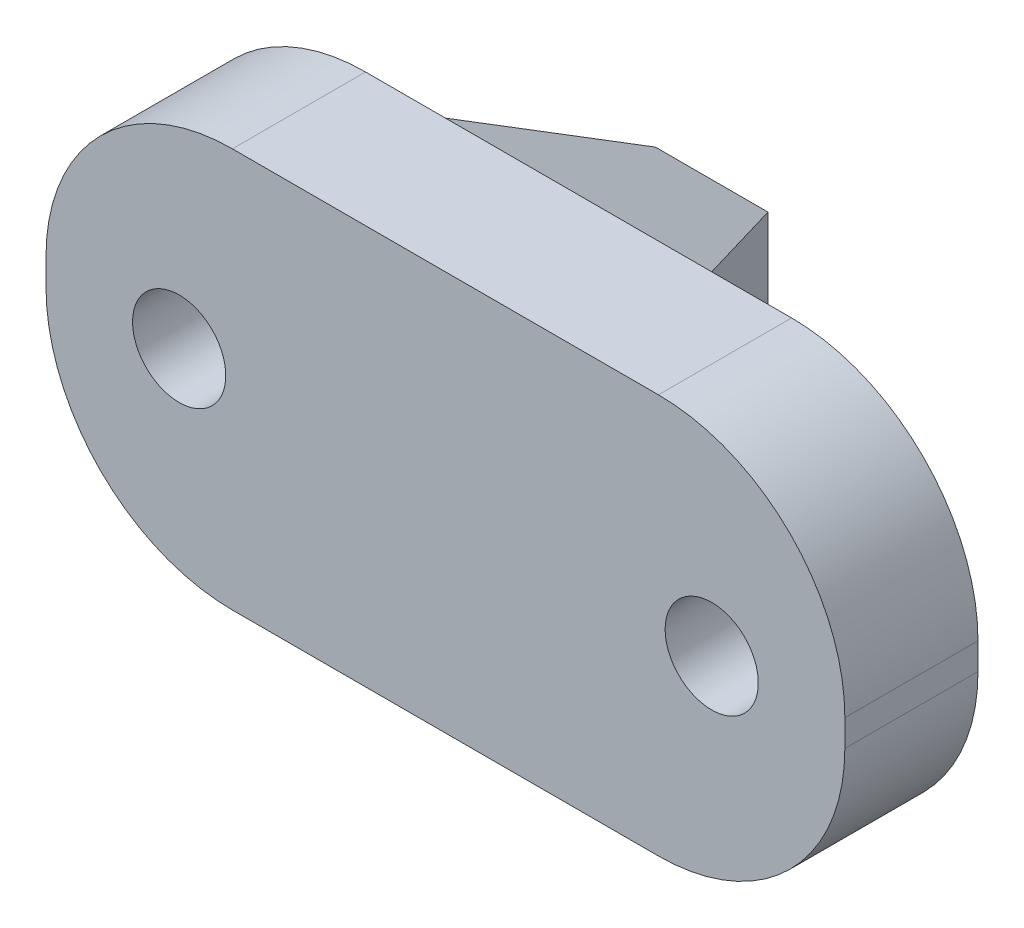
ISO-10303-21;
HEADER;
FILE_DESCRIPTION(('STEP AP214'),'2;1');
FILE_NAME('part.step','',(''),(''),'','','');
FILE_SCHEMA(('AUTOMOTIVE_DESIGN { 1 0 10303 214 1 1 1 1 }'));
ENDSEC;
DATA;
#1=APPLICATION_CONTEXT('core data for automotive mechanical design processes');
#2=APPLICATION_PROTOCOL_DEFINITION('international standard','automotive_design',2000,#1);
#3=PRODUCT_CONTEXT('',#1,'mechanical');
#4=PRODUCT('Part','Part','',(#3));
#5=PRODUCT_RELATED_PRODUCT_CATEGORY('part','',(#4));
#6=PRODUCT_DEFINITION_FORMATION('','',#4);
#7=PRODUCT_DEFINITION_CONTEXT('part definition',#1,'design');
#8=PRODUCT_DEFINITION('design','',#6,#7);
#9=PRODUCT_DEFINITION_SHAPE('','',#8);
#10=(LENGTH_UNIT() NAMED_UNIT(*) SI_UNIT(.MILLI.,.METRE.));
#11=(NAMED_UNIT(*) PLANE_ANGLE_UNIT() SI_UNIT($,.RADIAN.));
#12=(NAMED_UNIT(*) SI_UNIT($,.STERADIAN.) SOLID_ANGLE_UNIT());
#13=UNCERTAINTY_MEASURE_WITH_UNIT(LENGTH_MEASURE(1.E-05),#10,'distance_accuracy_value','');
#14=(GEOMETRIC_REPRESENTATION_CONTEXT(3) GLOBAL_UNCERTAINTY_ASSIGNED_CONTEXT((#13)) GLOBAL_UNIT_ASSIGNED_CONTEXT((#10,
#11,#12)) REPRESENTATION_CONTEXT('',''));
#15=CARTESIAN_POINT('',(0.,0.,0.));
#16=DIRECTION('',(0.,0.,1.));
#17=DIRECTION('',(1.,0.,0.));
#18=AXIS2_PLACEMENT_3D('',#15,#16,#17);
#19=CARTESIAN_POINT('',(-10.,7.5,9.99999999999998));
#20=DIRECTION('',(0.,0.,-1.));
#21=DIRECTION('',(-1.,0.,0.));
#22=AXIS2_PLACEMENT_3D('',#19,#20,#21);
#23=CYLINDRICAL_SURFACE('',#22,1.75);
#24=CARTESIAN_POINT('',(-10.,7.5,0.));
#25=DIRECTION('',(0.,0.,-1.));
#26=DIRECTION('',(-1.,0.,0.));
#27=AXIS2_PLACEMENT_3D('',#24,#25,#26);
#28=CIRCLE('',#27,1.75);
#29=CARTESIAN_POINT('',(-11.75,7.5,0.));
#30=VERTEX_POINT('',#29);
#31=EDGE_CURVE('E202',#30,#30,#28,.T.);
#32=ORIENTED_EDGE('',*,*,#31,.F.);
#33=EDGE_LOOP('',(#32));
#34=FACE_BOUND('',#33,.T.);
#35=CARTESIAN_POINT('',(-10.,7.5,-3.00000000000002));
#36=DIRECTION('',(0.,0.,-1.));
#37=DIRECTION('',(-1.,0.,0.));
#38=AXIS2_PLACEMENT_3D('',#35,#36,#37);
#39=CIRCLE('',#38,1.75);
#40=CARTESIAN_POINT('',(-11.75,7.5,-3.00000000000002));
#41=VERTEX_POINT('',#40);
#42=EDGE_CURVE('E204',#41,#41,#39,.F.);
#43=ORIENTED_EDGE('',*,*,#42,.F.);
#44=EDGE_LOOP('',(#43));
#45=FACE_BOUND('',#44,.T.);
#46=ADVANCED_FACE('F33',(#34,#45),#23,.F.);
#47=CARTESIAN_POINT('',(9.99999999999999,7.5,9.99999999999999));
#48=DIRECTION('',(0.,0.,-1.));
#49=DIRECTION('',(-1.,0.,0.));
#50=AXIS2_PLACEMENT_3D('',#47,#48,#49);
#51=CYLINDRICAL_SURFACE('',#50,1.75);
#52=CARTESIAN_POINT('',(9.99999999999999,7.5,0.));
#53=DIRECTION('',(0.,0.,-1.));
#54=DIRECTION('',(-1.,0.,0.));
#55=AXIS2_PLACEMENT_3D('',#52,#53,#54);
#56=CIRCLE('',#55,1.75);
#57=CARTESIAN_POINT('',(8.24999999999999,7.5,0.));
#58=VERTEX_POINT('',#57);
#59=EDGE_CURVE('E285',#58,#58,#56,.T.);
#60=ORIENTED_EDGE('',*,*,#59,.F.);
#61=EDGE_LOOP('',(#60));
#62=FACE_BOUND('',#61,.T.);
#63=CARTESIAN_POINT('',(10.,7.5,-3.));
#64=DIRECTION('',(0.,0.,-1.));
#65=DIRECTION('',(-1.,0.,0.));
#66=AXIS2_PLACEMENT_3D('',#63,#64,#65);
#67=CIRCLE('',#66,1.75);
#68=CARTESIAN_POINT('',(8.25,7.5,-3.00000000000001));
#69=VERTEX_POINT('',#68);
#70=EDGE_CURVE('E199',#69,#69,#67,.F.);
#71=ORIENTED_EDGE('',*,*,#70,.F.);
#72=EDGE_LOOP('',(#71));
#73=FACE_BOUND('',#72,.T.);
#74=ADVANCED_FACE('F345',(#62,#73),#51,.F.);
#75=CARTESIAN_POINT('',(-15.,15.,-5.));
#76=DIRECTION('',(1.,0.,0.));
#77=DIRECTION('',(0.,0.,-1.));
#78=AXIS2_PLACEMENT_3D('',#75,#76,#77);
#79=PLANE('',#78);
#80=DIRECTION('',(0.,-1.,0.));
#81=VECTOR('',#80,1.);
#82=CARTESIAN_POINT('',(-15.,15.,-5.));
#83=LINE('',#82,#81);
#84=CARTESIAN_POINT('',(-15.,8.,-5.));
#85=VERTEX_POINT('',#84);
#86=CARTESIAN_POINT('',(-15.,7.,-5.));
#87=VERTEX_POINT('',#86);
#88=EDGE_CURVE('E181',#85,#87,#83,.T.);
#89=ORIENTED_EDGE('',*,*,#88,.T.);
#90=DIRECTION('',(0.,0.,1.));
#91=VECTOR('',#90,1.);
#92=CARTESIAN_POINT('',(-15.,7.,-5.));
#93=LINE('',#92,#91);
#94=CARTESIAN_POINT('',(-15.,7.,0.));
#95=VERTEX_POINT('',#94);
#96=EDGE_CURVE('E232',#87,#95,#93,.T.);
#97=ORIENTED_EDGE('',*,*,#96,.T.);
#98=DIRECTION('',(0.,-1.,0.));
#99=VECTOR('',#98,1.);
#100=CARTESIAN_POINT('',(-15.,15.,0.));
#101=LINE('',#100,#99);
#102=CARTESIAN_POINT('',(-15.,8.,0.));
#103=VERTEX_POINT('',#102);
#104=EDGE_CURVE('E195',#103,#95,#101,.T.);
#105=ORIENTED_EDGE('',*,*,#104,.F.);
#106=DIRECTION('',(0.,0.,1.));
#107=VECTOR('',#106,1.);
#108=CARTESIAN_POINT('',(-15.,8.,-5.));
#109=LINE('',#108,#107);
#110=EDGE_CURVE('E230',#103,#85,#109,.F.);
#111=ORIENTED_EDGE('',*,*,#110,.T.);
#112=EDGE_LOOP('',(#89,#97,#105,#111));
#113=FACE_BOUND('',#112,.T.);
#114=ADVANCED_FACE('F300',(#113),#79,.F.);
#115=CARTESIAN_POINT('',(-15.,15.,0.));
#116=DIRECTION('',(0.,0.,-1.));
#117=DIRECTION('',(-1.,0.,0.));
#118=AXIS2_PLACEMENT_3D('',#115,#116,#117);
#119=PLANE('',#118);
#120=ORIENTED_EDGE('',*,*,#31,.T.);
#121=EDGE_LOOP('',(#120));
#122=FACE_BOUND('',#121,.T.);
#123=ORIENTED_EDGE('',*,*,#59,.T.);
#124=EDGE_LOOP('',(#123));
#125=FACE_BOUND('',#124,.T.);
#126=ORIENTED_EDGE('',*,*,#104,.T.);
#127=CARTESIAN_POINT('',(-8.,7.,0.));
#128=DIRECTION('',(0.,0.,-1.));
#129=DIRECTION('',(-1.,0.,0.));
#130=AXIS2_PLACEMENT_3D('',#127,#128,#129);
#131=CIRCLE('',#130,7.);
#132=CARTESIAN_POINT('',(-8.,0.,0.));
#133=VERTEX_POINT('',#132);
#134=EDGE_CURVE('E241',#95,#133,#131,.F.);
#135=ORIENTED_EDGE('',*,*,#134,.T.);
#136=DIRECTION('',(1.,0.,0.));
#137=VECTOR('',#136,1.);
#138=CARTESIAN_POINT('',(-15.,0.,0.));
#139=LINE('',#138,#137);
#140=CARTESIAN_POINT('',(8.,0.,0.));
#141=VERTEX_POINT('',#140);
#142=EDGE_CURVE('E282',#133,#141,#139,.T.);
#143=ORIENTED_EDGE('',*,*,#142,.T.);
#144=CARTESIAN_POINT('',(8.,7.,0.));
#145=DIRECTION('',(0.,0.,-1.));
#146=DIRECTION('',(-1.,0.,0.));
#147=AXIS2_PLACEMENT_3D('',#144,#145,#146);
#148=CIRCLE('',#147,7.);
#149=CARTESIAN_POINT('',(15.,7.,0.));
#150=VERTEX_POINT('',#149);
#151=EDGE_CURVE('E237',#141,#150,#148,.F.);
#152=ORIENTED_EDGE('',*,*,#151,.T.);
#153=DIRECTION('',(0.,-1.,0.));
#154=VECTOR('',#153,1.);
#155=CARTESIAN_POINT('',(15.,15.,0.));
#156=LINE('',#155,#154);
#157=CARTESIAN_POINT('',(15.,8.,0.));
#158=VERTEX_POINT('',#157);
#159=EDGE_CURVE('E192',#158,#150,#156,.T.);
#160=ORIENTED_EDGE('',*,*,#159,.F.);
#161=CARTESIAN_POINT('',(8.,8.,0.));
#162=DIRECTION('',(0.,0.,-1.));
#163=DIRECTION('',(-1.,0.,0.));
#164=AXIS2_PLACEMENT_3D('',#161,#162,#163);
#165=CIRCLE('',#164,7.);
#166=CARTESIAN_POINT('',(8.,15.,0.));
#167=VERTEX_POINT('',#166);
#168=EDGE_CURVE('E235',#158,#167,#165,.F.);
#169=ORIENTED_EDGE('',*,*,#168,.T.);
#170=DIRECTION('',(1.,0.,0.));
#171=VECTOR('',#170,1.);
#172=CARTESIAN_POINT('',(-15.,15.,0.));
#173=LINE('',#172,#171);
#174=CARTESIAN_POINT('',(-8.,15.,0.));
#175=VERTEX_POINT('',#174);
#176=EDGE_CURVE('E274',#175,#167,#173,.T.);
#177=ORIENTED_EDGE('',*,*,#176,.F.);
#178=CARTESIAN_POINT('',(-8.,8.,0.));
#179=DIRECTION('',(0.,0.,-1.));
#180=DIRECTION('',(-1.,0.,0.));
#181=AXIS2_PLACEMENT_3D('',#178,#179,#180);
#182=CIRCLE('',#181,7.);
#183=EDGE_CURVE('E239',#175,#103,#182,.F.);
#184=ORIENTED_EDGE('',*,*,#183,.T.);
#185=EDGE_LOOP('',(#126,#135,#143,#152,#160,#169,#177,#184));
#186=FACE_BOUND('',#185,.T.);
#187=ADVANCED_FACE('F265',(#122,#125,#186),#119,.F.);
#188=CARTESIAN_POINT('',(15.,15.,0.));
#189=DIRECTION('',(-1.,0.,0.));
#190=DIRECTION('',(0.,0.,1.));
#191=AXIS2_PLACEMENT_3D('',#188,#189,#190);
#192=PLANE('',#191);
#193=ORIENTED_EDGE('',*,*,#159,.T.);
#194=DIRECTION('',(0.,0.,-1.));
#195=VECTOR('',#194,1.);
#196=CARTESIAN_POINT('',(15.,7.,0.));
#197=LINE('',#196,#195);
#198=CARTESIAN_POINT('',(15.,7.,-5.));
#199=VERTEX_POINT('',#198);
#200=EDGE_CURVE('E11',#150,#199,#197,.T.);
#201=ORIENTED_EDGE('',*,*,#200,.T.);
#202=DIRECTION('',(0.,-1.,0.));
#203=VECTOR('',#202,1.);
#204=CARTESIAN_POINT('',(15.,15.,-5.));
#205=LINE('',#204,#203);
#206=CARTESIAN_POINT('',(15.,8.,-5.));
#207=VERTEX_POINT('',#206);
#208=EDGE_CURVE('E190',#207,#199,#205,.T.);
#209=ORIENTED_EDGE('',*,*,#208,.F.);
#210=DIRECTION('',(0.,0.,-1.));
#211=VECTOR('',#210,1.);
#212=CARTESIAN_POINT('',(15.,8.,0.));
#213=LINE('',#212,#211);
#214=EDGE_CURVE('E41',#207,#158,#213,.F.);
#215=ORIENTED_EDGE('',*,*,#214,.T.);
#216=EDGE_LOOP('',(#193,#201,#209,#215));
#217=FACE_BOUND('',#216,.T.);
#218=ADVANCED_FACE('F261',(#217),#192,.F.);
#219=CARTESIAN_POINT('',(5.,15.,-5.00000000000001));
#220=DIRECTION('',(-0.866025403784439,0.,0.499999999999999));
#221=DIRECTION('',(0.499999999999999,0.,0.866025403784439));
#222=AXIS2_PLACEMENT_3D('',#219,#220,#221);
#223=PLANE('',#222);
#224=DIRECTION('',(0.,-1.,0.));
#225=VECTOR('',#224,1.);
#226=CARTESIAN_POINT('',(5.,15.,-5.00000000000001));
#227=LINE('',#226,#225);
#228=CARTESIAN_POINT('',(5.,15.,-5.00000000000001));
#229=VERTEX_POINT('',#228);
#230=CARTESIAN_POINT('',(5.00000000000001,10.,-5.));
#231=VERTEX_POINT('',#230);
#232=EDGE_CURVE('E188',#229,#231,#227,.T.);
#233=ORIENTED_EDGE('',*,*,#232,.T.);
#234=DIRECTION('',(-0.499999999999999,0.,-0.866025403784439));
#235=VECTOR('',#234,1.);
#236=CARTESIAN_POINT('',(5.,10.,-5.00000000000001));
#237=LINE('',#236,#235);
#238=CARTESIAN_POINT('',(3.26794919243113,10.,-8.));
#239=VERTEX_POINT('',#238);
#240=EDGE_CURVE('E153',#231,#239,#237,.T.);
#241=ORIENTED_EDGE('',*,*,#240,.T.);
#242=DIRECTION('',(0.,-1.,0.));
#243=VECTOR('',#242,1.);
#244=CARTESIAN_POINT('',(3.26794919243113,15.,-8.));
#245=LINE('',#244,#243);
#246=CARTESIAN_POINT('',(3.26794919243113,5.,-8.));
#247=VERTEX_POINT('',#246);
#248=EDGE_CURVE('E328',#239,#247,#245,.T.);
#249=ORIENTED_EDGE('',*,*,#248,.T.);
#250=DIRECTION('',(0.499999999999999,0.,0.866025403784439));
#251=VECTOR('',#250,1.);
#252=CARTESIAN_POINT('',(5.,5.,-5.00000000000001));
#253=LINE('',#252,#251);
#254=CARTESIAN_POINT('',(5.,5.,-5.00000000000001));
#255=VERTEX_POINT('',#254);
#256=EDGE_CURVE('E169',#247,#255,#253,.T.);
#257=ORIENTED_EDGE('',*,*,#256,.T.);
#258=CARTESIAN_POINT('',(5.,0.,-5.00000000000001));
#259=VERTEX_POINT('',#258);
#260=EDGE_CURVE('E187',#255,#259,#227,.T.);
#261=ORIENTED_EDGE('',*,*,#260,.T.);
#262=DIRECTION('',(0.472455591261534,-0.327326835353986,0.818317088384973));
#263=VECTOR('',#262,1.);
#264=CARTESIAN_POINT('',(2.11324865405188,2.00000000000001,-10.));
#265=LINE('',#264,#263);
#266=CARTESIAN_POINT('',(2.11324865405188,2.00000000000001,-10.));
#267=VERTEX_POINT('',#266);
#268=EDGE_CURVE('E227',#259,#267,#265,.F.);
#269=ORIENTED_EDGE('',*,*,#268,.T.);
#270=DIRECTION('',(0.,-1.,0.));
#271=VECTOR('',#270,1.);
#272=CARTESIAN_POINT('',(2.11324865405188,15.,-10.));
#273=LINE('',#272,#271);
#274=CARTESIAN_POINT('',(2.11324865405188,13.,-10.));
#275=VERTEX_POINT('',#274);
#276=EDGE_CURVE('E179',#275,#267,#273,.T.);
#277=ORIENTED_EDGE('',*,*,#276,.F.);
#278=DIRECTION('',(0.472455591261533,0.327326835353987,0.818317088384973));
#279=VECTOR('',#278,1.);
#280=CARTESIAN_POINT('',(3.8839285714286,14.2267630323353,-6.93309241916167));
#281=LINE('',#280,#279);
#282=EDGE_CURVE('E215',#275,#229,#281,.T.);
#283=ORIENTED_EDGE('',*,*,#282,.T.);
#284=EDGE_LOOP('',(#233,#241,#249,#257,#261,#269,#277,#283));
#285=FACE_BOUND('',#284,.T.);
#286=ADVANCED_FACE('F384',(#285),#223,.F.);
#287=CARTESIAN_POINT('',(2.11324865405188,15.,-10.));
#288=DIRECTION('',(0.,0.,1.));
#289=DIRECTION('',(1.,0.,0.));
#290=AXIS2_PLACEMENT_3D('',#287,#288,#289);
#291=PLANE('',#290);
#292=ORIENTED_EDGE('',*,*,#276,.T.);
#293=DIRECTION('',(-1.,0.,0.));
#294=VECTOR('',#293,1.);
#295=CARTESIAN_POINT('',(2.11324865405188,2.00000000000001,-10.));
#296=LINE('',#295,#294);
#297=CARTESIAN_POINT('',(-2.11324865405188,2.00000000000001,-10.));
#298=VERTEX_POINT('',#297);
#299=EDGE_CURVE('E218',#267,#298,#296,.T.);
#300=ORIENTED_EDGE('',*,*,#299,.T.);
#301=DIRECTION('',(0.,-1.,0.));
#302=VECTOR('',#301,1.);
#303=CARTESIAN_POINT('',(-2.11324865405188,15.,-10.));
#304=LINE('',#303,#302);
#305=CARTESIAN_POINT('',(-2.11324865405188,13.,-10.));
#306=VERTEX_POINT('',#305);
#307=EDGE_CURVE('E175',#306,#298,#304,.T.);
#308=ORIENTED_EDGE('',*,*,#307,.F.);
#309=DIRECTION('',(1.,0.,0.));
#310=VECTOR('',#309,1.);
#311=CARTESIAN_POINT('',(2.11324865405188,13.,-10.));
#312=LINE('',#311,#310);
#313=EDGE_CURVE('E213',#306,#275,#312,.T.);
#314=ORIENTED_EDGE('',*,*,#313,.T.);
#315=EDGE_LOOP('',(#292,#300,#308,#314));
#316=FACE_BOUND('',#315,.T.);
#317=ADVANCED_FACE('F313',(#316),#291,.F.);
#318=CARTESIAN_POINT('',(-2.11324865405188,15.,-10.));
#319=DIRECTION('',(0.866025403784439,0.,0.499999999999999));
#320=DIRECTION('',(0.499999999999999,0.,-0.866025403784439));
#321=AXIS2_PLACEMENT_3D('',#318,#319,#320);
#322=PLANE('',#321);
#323=DIRECTION('',(0.,1.,0.));
#324=VECTOR('',#323,1.);
#325=CARTESIAN_POINT('',(-3.26794919243113,15.,-8.));
#326=LINE('',#325,#324);
#327=CARTESIAN_POINT('',(-3.26794919243113,5.,-8.));
#328=VERTEX_POINT('',#327);
#329=CARTESIAN_POINT('',(-3.26794919243113,10.,-8.));
#330=VERTEX_POINT('',#329);
#331=EDGE_CURVE('E168',#328,#330,#326,.T.);
#332=ORIENTED_EDGE('',*,*,#331,.T.);
#333=DIRECTION('',(-0.499999999999999,0.,0.866025403784439));
#334=VECTOR('',#333,1.);
#335=CARTESIAN_POINT('',(-2.11324865405188,10.,-10.));
#336=LINE('',#335,#334);
#337=CARTESIAN_POINT('',(-5.,10.,-5.));
#338=VERTEX_POINT('',#337);
#339=EDGE_CURVE('E150',#330,#338,#336,.T.);
#340=ORIENTED_EDGE('',*,*,#339,.T.);
#341=DIRECTION('',(0.,-1.,0.));
#342=VECTOR('',#341,1.);
#343=CARTESIAN_POINT('',(-5.,15.,-5.00000000000001));
#344=LINE('',#343,#342);
#345=CARTESIAN_POINT('',(-5.,15.,-5.00000000000001));
#346=VERTEX_POINT('',#345);
#347=EDGE_CURVE('E164',#346,#338,#344,.T.);
#348=ORIENTED_EDGE('',*,*,#347,.F.);
#349=DIRECTION('',(0.472455591261533,-0.327326835353987,-0.818317088384973));
#350=VECTOR('',#349,1.);
#351=CARTESIAN_POINT('',(-3.8839285714286,14.2267630323353,-6.93309241916167));
#352=LINE('',#351,#350);
#353=EDGE_CURVE('E211',#346,#306,#352,.T.);
#354=ORIENTED_EDGE('',*,*,#353,.T.);
#355=ORIENTED_EDGE('',*,*,#307,.T.);
#356=DIRECTION('',(0.472455591261534,0.327326835353986,-0.818317088384973));
#357=VECTOR('',#356,1.);
#358=CARTESIAN_POINT('',(-1.16983407635015,2.65361679247221,-11.6340419811805));
#359=LINE('',#358,#357);
#360=CARTESIAN_POINT('',(-5.,0.,-5.00000000000001));
#361=VERTEX_POINT('',#360);
#362=EDGE_CURVE('E221',#298,#361,#359,.F.);
#363=ORIENTED_EDGE('',*,*,#362,.T.);
#364=CARTESIAN_POINT('',(-5.,5.,-5.));
#365=VERTEX_POINT('',#364);
#366=EDGE_CURVE('E176',#365,#361,#344,.T.);
#367=ORIENTED_EDGE('',*,*,#366,.F.);
#368=DIRECTION('',(0.499999999999999,0.,-0.866025403784439));
#369=VECTOR('',#368,1.);
#370=CARTESIAN_POINT('',(-2.11324865405188,5.,-10.));
#371=LINE('',#370,#369);
#372=EDGE_CURVE('E157',#365,#328,#371,.T.);
#373=ORIENTED_EDGE('',*,*,#372,.T.);
#374=EDGE_LOOP('',(#332,#340,#348,#354,#355,#363,#367,#373));
#375=FACE_BOUND('',#374,.T.);
#376=ADVANCED_FACE('F163',(#375),#322,.F.);
#377=CARTESIAN_POINT('',(-5.,15.,-5.00000000000001));
#378=DIRECTION('',(0.,0.,1.));
#379=DIRECTION('',(1.,0.,0.));
#380=AXIS2_PLACEMENT_3D('',#377,#378,#379);
#381=PLANE('',#380);
#382=CARTESIAN_POINT('',(10.,7.5,-5.));
#383=DIRECTION('',(0.,0.,-1.));
#384=DIRECTION('',(-1.,0.,0.));
#385=AXIS2_PLACEMENT_3D('',#382,#383,#384);
#386=CIRCLE('',#385,3.);
#387=CARTESIAN_POINT('',(7.,7.5,-5.00000000000001));
#388=VERTEX_POINT('',#387);
#389=EDGE_CURVE('E207',#388,#388,#386,.T.);
#390=ORIENTED_EDGE('',*,*,#389,.F.);
#391=EDGE_LOOP('',(#390));
#392=FACE_BOUND('',#391,.T.);
#393=CARTESIAN_POINT('',(-10.,7.5,-5.00000000000002));
#394=DIRECTION('',(0.,0.,-1.));
#395=DIRECTION('',(-1.,0.,0.));
#396=AXIS2_PLACEMENT_3D('',#393,#394,#395);
#397=CIRCLE('',#396,3.);
#398=CARTESIAN_POINT('',(-13.,7.5,-5.00000000000002));
#399=VERTEX_POINT('',#398);
#400=EDGE_CURVE('E331',#399,#399,#397,.T.);
#401=ORIENTED_EDGE('',*,*,#400,.F.);
#402=EDGE_LOOP('',(#401));
#403=FACE_BOUND('',#402,.T.);
#404=DIRECTION('',(-1.,0.,0.));
#405=VECTOR('',#404,1.);
#406=CARTESIAN_POINT('',(-5.,0.,-5.00000000000001));
#407=LINE('',#406,#405);
#408=CARTESIAN_POINT('',(-8.,0.,-5.00000000000001));
#409=VERTEX_POINT('',#408);
#410=EDGE_CURVE('E278',#361,#409,#407,.T.);
#411=ORIENTED_EDGE('',*,*,#410,.T.);
#412=CARTESIAN_POINT('',(-8.,7.,-5.00000000000001));
#413=DIRECTION('',(0.,0.,1.));
#414=DIRECTION('',(1.,0.,0.));
#415=AXIS2_PLACEMENT_3D('',#412,#413,#414);
#416=CIRCLE('',#415,7.);
#417=EDGE_CURVE('E251',#409,#87,#416,.F.);
#418=ORIENTED_EDGE('',*,*,#417,.T.);
#419=ORIENTED_EDGE('',*,*,#88,.F.);
#420=CARTESIAN_POINT('',(-8.,8.,-5.00000000000001));
#421=DIRECTION('',(0.,0.,1.));
#422=DIRECTION('',(1.,0.,0.));
#423=AXIS2_PLACEMENT_3D('',#420,#421,#422);
#424=CIRCLE('',#423,7.);
#425=CARTESIAN_POINT('',(-8.,15.,-5.00000000000001));
#426=VERTEX_POINT('',#425);
#427=EDGE_CURVE('E249',#85,#426,#424,.F.);
#428=ORIENTED_EDGE('',*,*,#427,.T.);
#429=DIRECTION('',(-1.,0.,0.));
#430=VECTOR('',#429,1.);
#431=CARTESIAN_POINT('',(-5.,15.,-5.00000000000001));
#432=LINE('',#431,#430);
#433=EDGE_CURVE('E174',#346,#426,#432,.T.);
#434=ORIENTED_EDGE('',*,*,#433,.F.);
#435=ORIENTED_EDGE('',*,*,#347,.T.);
#436=DIRECTION('',(1.,0.,0.));
#437=VECTOR('',#436,1.);
#438=CARTESIAN_POINT('',(-15.,10.,-5.));
#439=LINE('',#438,#437);
#440=EDGE_CURVE('E146',#338,#231,#439,.T.);
#441=ORIENTED_EDGE('',*,*,#440,.T.);
#442=ORIENTED_EDGE('',*,*,#232,.F.);
#443=DIRECTION('',(-1.,0.,0.));
#444=VECTOR('',#443,1.);
#445=CARTESIAN_POINT('',(15.,15.,-5.));
#446=LINE('',#445,#444);
#447=CARTESIAN_POINT('',(8.,15.,-5.00000000000001));
#448=VERTEX_POINT('',#447);
#449=EDGE_CURVE('E273',#448,#229,#446,.T.);
#450=ORIENTED_EDGE('',*,*,#449,.F.);
#451=CARTESIAN_POINT('',(8.,8.,-5.00000000000002));
#452=DIRECTION('',(0.,0.,1.));
#453=DIRECTION('',(1.,0.,0.));
#454=AXIS2_PLACEMENT_3D('',#451,#452,#453);
#455=CIRCLE('',#454,7.);
#456=EDGE_CURVE('E55',#448,#207,#455,.F.);
#457=ORIENTED_EDGE('',*,*,#456,.T.);
#458=ORIENTED_EDGE('',*,*,#208,.T.);
#459=CARTESIAN_POINT('',(8.,7.,-5.00000000000002));
#460=DIRECTION('',(0.,0.,1.));
#461=DIRECTION('',(1.,0.,0.));
#462=AXIS2_PLACEMENT_3D('',#459,#460,#461);
#463=CIRCLE('',#462,7.);
#464=CARTESIAN_POINT('',(8.,0.,-5.00000000000001));
#465=VERTEX_POINT('',#464);
#466=EDGE_CURVE('E48',#199,#465,#463,.F.);
#467=ORIENTED_EDGE('',*,*,#466,.T.);
#468=DIRECTION('',(-1.,0.,0.));
#469=VECTOR('',#468,1.);
#470=CARTESIAN_POINT('',(15.,0.,-5.));
#471=LINE('',#470,#469);
#472=EDGE_CURVE('E284',#465,#259,#471,.T.);
#473=ORIENTED_EDGE('',*,*,#472,.T.);
#474=ORIENTED_EDGE('',*,*,#260,.F.);
#475=DIRECTION('',(1.,0.,0.));
#476=VECTOR('',#475,1.);
#477=CARTESIAN_POINT('',(-15.,5.,-5.));
#478=LINE('',#477,#476);
#479=EDGE_CURVE('E324',#365,#255,#478,.T.);
#480=ORIENTED_EDGE('',*,*,#479,.F.);
#481=ORIENTED_EDGE('',*,*,#366,.T.);
#482=EDGE_LOOP('',(#411,#418,#419,#428,#434,#435,#441,#442,#450,#457,#458,#467,#473,#474,#480,#481));
#483=FACE_BOUND('',#482,.T.);
#484=ADVANCED_FACE('F172',(#392,#403,#483),#381,.F.);
#485=CARTESIAN_POINT('',(0.,15.,0.));
#486=DIRECTION('',(0.,1.,0.));
#487=DIRECTION('',(0.,0.,1.));
#488=AXIS2_PLACEMENT_3D('',#485,#486,#487);
#489=PLANE('',#488);
#490=ORIENTED_EDGE('',*,*,#433,.T.);
#491=DIRECTION('',(0.,0.,1.));
#492=VECTOR('',#491,1.);
#493=CARTESIAN_POINT('',(-8.,15.,0.));
#494=LINE('',#493,#492);
#495=EDGE_CURVE('E256',#426,#175,#494,.T.);
#496=ORIENTED_EDGE('',*,*,#495,.T.);
#497=ORIENTED_EDGE('',*,*,#176,.T.);
#498=DIRECTION('',(0.,0.,-1.));
#499=VECTOR('',#498,1.);
#500=CARTESIAN_POINT('',(8.,15.,-5.));
#501=LINE('',#500,#499);
#502=EDGE_CURVE('E253',#167,#448,#501,.T.);
#503=ORIENTED_EDGE('',*,*,#502,.T.);
#504=ORIENTED_EDGE('',*,*,#449,.T.);
#505=DIRECTION('',(-1.,0.,0.));
#506=VECTOR('',#505,1.);
#507=CARTESIAN_POINT('',(-2.11324865405188,15.,-4.99999999999996));
#508=LINE('',#507,#506);
#509=EDGE_CURVE('E198',#229,#346,#508,.T.);
#510=ORIENTED_EDGE('',*,*,#509,.T.);
#511=EDGE_LOOP('',(#490,#496,#497,#503,#504,#510));
#512=FACE_BOUND('',#511,.T.);
#513=ADVANCED_FACE('F272',(#512),#489,.T.);
#514=CARTESIAN_POINT('',(0.,0.,0.));
#515=DIRECTION('',(0.,1.,0.));
#516=DIRECTION('',(0.,0.,1.));
#517=AXIS2_PLACEMENT_3D('',#514,#515,#516);
#518=PLANE('',#517);
#519=ORIENTED_EDGE('',*,*,#142,.F.);
#520=DIRECTION('',(0.,0.,1.));
#521=VECTOR('',#520,1.);
#522=CARTESIAN_POINT('',(-8.,0.,0.));
#523=LINE('',#522,#521);
#524=EDGE_CURVE('E245',#133,#409,#523,.F.);
#525=ORIENTED_EDGE('',*,*,#524,.T.);
#526=ORIENTED_EDGE('',*,*,#410,.F.);
#527=DIRECTION('',(1.,0.,0.));
#528=VECTOR('',#527,1.);
#529=CARTESIAN_POINT('',(0.,0.,-4.99999999999995));
#530=LINE('',#529,#528);
#531=EDGE_CURVE('E224',#361,#259,#530,.T.);
#532=ORIENTED_EDGE('',*,*,#531,.T.);
#533=ORIENTED_EDGE('',*,*,#472,.F.);
#534=DIRECTION('',(0.,0.,-1.));
#535=VECTOR('',#534,1.);
#536=CARTESIAN_POINT('',(8.,0.,0.));
#537=LINE('',#536,#535);
#538=EDGE_CURVE('E243',#465,#141,#537,.F.);
#539=ORIENTED_EDGE('',*,*,#538,.T.);
#540=EDGE_LOOP('',(#519,#525,#526,#532,#533,#539));
#541=FACE_BOUND('',#540,.T.);
#542=ADVANCED_FACE('F354',(#541),#518,.F.);
#543=CARTESIAN_POINT('',(10.,7.5,-3.));
#544=DIRECTION('',(0.,0.,-1.));
#545=DIRECTION('',(-1.,0.,0.));
#546=AXIS2_PLACEMENT_3D('',#543,#544,#545);
#547=PLANE('',#546);
#548=CARTESIAN_POINT('',(10.,7.5,-3.));
#549=DIRECTION('',(0.,0.,-1.));
#550=DIRECTION('',(-1.,0.,0.));
#551=AXIS2_PLACEMENT_3D('',#548,#549,#550);
#552=CIRCLE('',#551,3.);
#553=CARTESIAN_POINT('',(7.,7.5,-3.00000000000001));
#554=VERTEX_POINT('',#553);
#555=EDGE_CURVE('E203',#554,#554,#552,.T.);
#556=ORIENTED_EDGE('',*,*,#555,.T.);
#557=EDGE_LOOP('',(#556));
#558=FACE_BOUND('',#557,.T.);
#559=ORIENTED_EDGE('',*,*,#70,.T.);
#560=EDGE_LOOP('',(#559));
#561=FACE_BOUND('',#560,.T.);
#562=ADVANCED_FACE('F351',(#558,#561),#547,.T.);
#563=CARTESIAN_POINT('',(10.,7.5,-3.));
#564=DIRECTION('',(0.,0.,-1.));
#565=DIRECTION('',(-1.,0.,0.));
#566=AXIS2_PLACEMENT_3D('',#563,#564,#565);
#567=CYLINDRICAL_SURFACE('',#566,3.);
#568=ORIENTED_EDGE('',*,*,#555,.F.);
#569=EDGE_LOOP('',(#568));
#570=FACE_BOUND('',#569,.T.);
#571=ORIENTED_EDGE('',*,*,#389,.T.);
#572=EDGE_LOOP('',(#571));
#573=FACE_BOUND('',#572,.T.);
#574=ADVANCED_FACE('F353',(#570,#573),#567,.F.);
#575=CARTESIAN_POINT('',(-10.,7.5,-3.00000000000002));
#576=DIRECTION('',(0.,0.,-1.));
#577=DIRECTION('',(-1.,0.,0.));
#578=AXIS2_PLACEMENT_3D('',#575,#576,#577);
#579=PLANE('',#578);
#580=CARTESIAN_POINT('',(-10.,7.5,-3.00000000000002));
#581=DIRECTION('',(0.,0.,-1.));
#582=DIRECTION('',(-1.,0.,0.));
#583=AXIS2_PLACEMENT_3D('',#580,#581,#582);
#584=CIRCLE('',#583,3.);
#585=CARTESIAN_POINT('',(-13.,7.5,-3.00000000000002));
#586=VERTEX_POINT('',#585);
#587=EDGE_CURVE('E208',#586,#586,#584,.T.);
#588=ORIENTED_EDGE('',*,*,#587,.T.);
#589=EDGE_LOOP('',(#588));
#590=FACE_BOUND('',#589,.T.);
#591=ORIENTED_EDGE('',*,*,#42,.T.);
#592=EDGE_LOOP('',(#591));
#593=FACE_BOUND('',#592,.T.);
#594=ADVANCED_FACE('F361',(#590,#593),#579,.T.);
#595=CARTESIAN_POINT('',(-10.,7.5,-3.00000000000002));
#596=DIRECTION('',(0.,0.,-1.));
#597=DIRECTION('',(-1.,0.,0.));
#598=AXIS2_PLACEMENT_3D('',#595,#596,#597);
#599=CYLINDRICAL_SURFACE('',#598,3.);
#600=ORIENTED_EDGE('',*,*,#587,.F.);
#601=EDGE_LOOP('',(#600));
#602=FACE_BOUND('',#601,.T.);
#603=ORIENTED_EDGE('',*,*,#400,.T.);
#604=EDGE_LOOP('',(#603));
#605=FACE_BOUND('',#604,.T.);
#606=ADVANCED_FACE('F397',(#602,#605),#599,.F.);
#607=CARTESIAN_POINT('',(0.,15.,-4.99999999999996));
#608=DIRECTION('',(0.,0.92847669088526,-0.371390676354101));
#609=DIRECTION('',(1.,0.,0.));
#610=AXIS2_PLACEMENT_3D('',#607,#608,#609);
#611=PLANE('',#610);
#612=ORIENTED_EDGE('',*,*,#282,.F.);
#613=ORIENTED_EDGE('',*,*,#313,.F.);
#614=ORIENTED_EDGE('',*,*,#353,.F.);
#615=ORIENTED_EDGE('',*,*,#509,.F.);
#616=EDGE_LOOP('',(#612,#613,#614,#615));
#617=FACE_BOUND('',#616,.T.);
#618=ADVANCED_FACE('F309',(#617),#611,.T.);
#619=CARTESIAN_POINT('',(2.11324865405188,2.00000000000001,-10.));
#620=DIRECTION('',(0.,0.92847669088526,0.371390676354101));
#621=DIRECTION('',(-1.,0.,0.));
#622=AXIS2_PLACEMENT_3D('',#619,#620,#621);
#623=PLANE('',#622);
#624=ORIENTED_EDGE('',*,*,#268,.F.);
#625=ORIENTED_EDGE('',*,*,#531,.F.);
#626=ORIENTED_EDGE('',*,*,#362,.F.);
#627=ORIENTED_EDGE('',*,*,#299,.F.);
#628=EDGE_LOOP('',(#624,#625,#626,#627));
#629=FACE_BOUND('',#628,.T.);
#630=ADVANCED_FACE('F318',(#629),#623,.F.);
#631=CARTESIAN_POINT('',(-15.,10.,-8.));
#632=DIRECTION('',(0.,0.,-1.));
#633=DIRECTION('',(-1.,0.,0.));
#634=AXIS2_PLACEMENT_3D('',#631,#632,#633);
#635=PLANE('',#634);
#636=DIRECTION('',(1.,0.,0.));
#637=VECTOR('',#636,1.);
#638=CARTESIAN_POINT('',(-15.,10.,-8.));
#639=LINE('',#638,#637);
#640=EDGE_CURVE('E158',#330,#239,#639,.T.);
#641=ORIENTED_EDGE('',*,*,#640,.F.);
#642=ORIENTED_EDGE('',*,*,#331,.F.);
#643=DIRECTION('',(1.,0.,0.));
#644=VECTOR('',#643,1.);
#645=CARTESIAN_POINT('',(-15.,5.,-8.));
#646=LINE('',#645,#644);
#647=EDGE_CURVE('E414',#328,#247,#646,.T.);
#648=ORIENTED_EDGE('',*,*,#647,.T.);
#649=ORIENTED_EDGE('',*,*,#248,.F.);
#650=EDGE_LOOP('',(#641,#642,#648,#649));
#651=FACE_BOUND('',#650,.T.);
#652=ADVANCED_FACE('F400',(#651),#635,.F.);
#653=CARTESIAN_POINT('',(-15.,10.,-5.));
#654=DIRECTION('',(0.,1.,0.));
#655=DIRECTION('',(0.,0.,1.));
#656=AXIS2_PLACEMENT_3D('',#653,#654,#655);
#657=PLANE('',#656);
#658=ORIENTED_EDGE('',*,*,#440,.F.);
#659=ORIENTED_EDGE('',*,*,#339,.F.);
#660=ORIENTED_EDGE('',*,*,#640,.T.);
#661=ORIENTED_EDGE('',*,*,#240,.F.);
#662=EDGE_LOOP('',(#658,#659,#660,#661));
#663=FACE_BOUND('',#662,.T.);
#664=ADVANCED_FACE('F148',(#663),#657,.F.);
#665=CARTESIAN_POINT('',(-15.,5.,-5.));
#666=DIRECTION('',(0.,-1.,0.));
#667=DIRECTION('',(0.,0.,-1.));
#668=AXIS2_PLACEMENT_3D('',#665,#666,#667);
#669=PLANE('',#668);
#670=ORIENTED_EDGE('',*,*,#647,.F.);
#671=ORIENTED_EDGE('',*,*,#372,.F.);
#672=ORIENTED_EDGE('',*,*,#479,.T.);
#673=ORIENTED_EDGE('',*,*,#256,.F.);
#674=EDGE_LOOP('',(#670,#671,#672,#673));
#675=FACE_BOUND('',#674,.T.);
#676=ADVANCED_FACE('F403',(#675),#669,.F.);
#677=CARTESIAN_POINT('',(-8.,7.,-5.));
#678=DIRECTION('',(0.,0.,1.));
#679=DIRECTION('',(1.,0.,0.));
#680=AXIS2_PLACEMENT_3D('',#677,#678,#679);
#681=CYLINDRICAL_SURFACE('',#680,7.);
#682=ORIENTED_EDGE('',*,*,#417,.F.);
#683=ORIENTED_EDGE('',*,*,#524,.F.);
#684=ORIENTED_EDGE('',*,*,#134,.F.);
#685=ORIENTED_EDGE('',*,*,#96,.F.);
#686=EDGE_LOOP('',(#682,#683,#684,#685));
#687=FACE_BOUND('',#686,.T.);
#688=ADVANCED_FACE('F297',(#687),#681,.T.);
#689=CARTESIAN_POINT('',(-8.,8.,0.));
#690=DIRECTION('',(0.,0.,-1.));
#691=DIRECTION('',(-1.,0.,0.));
#692=AXIS2_PLACEMENT_3D('',#689,#690,#691);
#693=CYLINDRICAL_SURFACE('',#692,7.);
#694=ORIENTED_EDGE('',*,*,#427,.F.);
#695=ORIENTED_EDGE('',*,*,#110,.F.);
#696=ORIENTED_EDGE('',*,*,#183,.F.);
#697=ORIENTED_EDGE('',*,*,#495,.F.);
#698=EDGE_LOOP('',(#694,#695,#696,#697));
#699=FACE_BOUND('',#698,.T.);
#700=ADVANCED_FACE('F306',(#699),#693,.T.);
#701=CARTESIAN_POINT('',(8.,7.,0.));
#702=DIRECTION('',(0.,0.,-1.));
#703=DIRECTION('',(-1.,0.,0.));
#704=AXIS2_PLACEMENT_3D('',#701,#702,#703);
#705=CYLINDRICAL_SURFACE('',#704,7.);
#706=ORIENTED_EDGE('',*,*,#151,.F.);
#707=ORIENTED_EDGE('',*,*,#538,.F.);
#708=ORIENTED_EDGE('',*,*,#466,.F.);
#709=ORIENTED_EDGE('',*,*,#200,.F.);
#710=EDGE_LOOP('',(#706,#707,#708,#709));
#711=FACE_BOUND('',#710,.T.);
#712=ADVANCED_FACE('F405',(#711),#705,.T.);
#713=CARTESIAN_POINT('',(8.,8.,0.));
#714=DIRECTION('',(0.,0.,1.));
#715=DIRECTION('',(1.,0.,0.));
#716=AXIS2_PLACEMENT_3D('',#713,#714,#715);
#717=CYLINDRICAL_SURFACE('',#716,7.);
#718=ORIENTED_EDGE('',*,*,#168,.F.);
#719=ORIENTED_EDGE('',*,*,#214,.F.);
#720=ORIENTED_EDGE('',*,*,#456,.F.);
#721=ORIENTED_EDGE('',*,*,#502,.F.);
#722=EDGE_LOOP('',(#718,#719,#720,#721));
#723=FACE_BOUND('',#722,.T.);
#724=ADVANCED_FACE('F35',(#723),#717,.T.);
#725=CLOSED_SHELL('',(#46,#74,#114,#187,#218,#286,#317,#376,#484,#513,#542,#562,#574,#594,#606,
#618,#630,#652,#664,#676,#688,#700,#712,#724));
#726=MANIFOLD_SOLID_BREP('B2',#725);
#727=ADVANCED_BREP_SHAPE_REPRESENTATION('',(#18,#726),#14);
#728=SHAPE_DEFINITION_REPRESENTATION(#9,#727);
ENDSEC;
END-ISO-10303-21;
